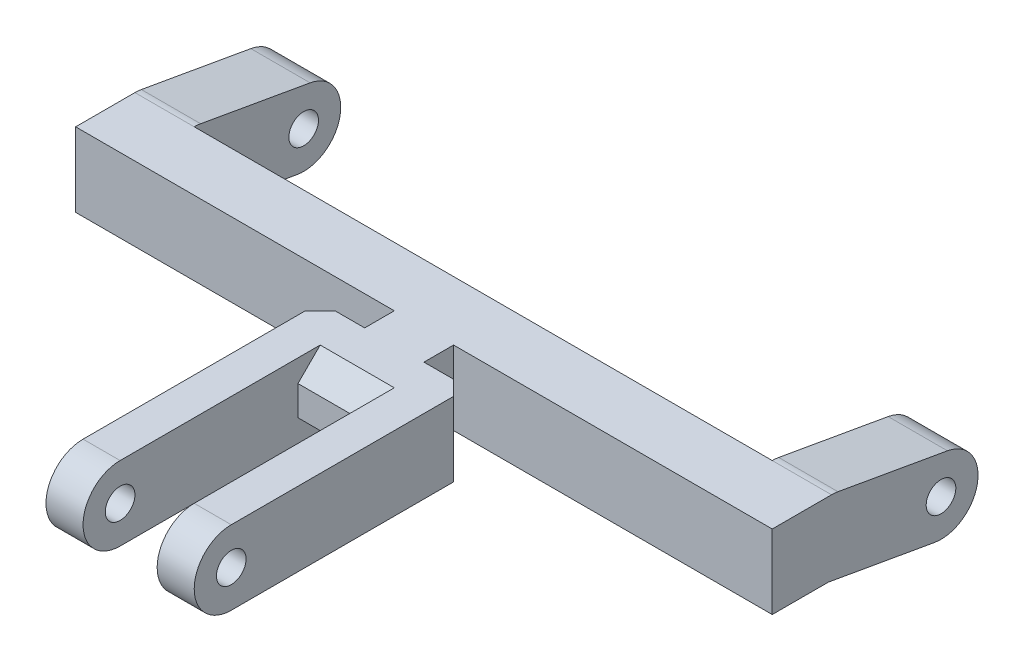
ISO-10303-21;
HEADER;
FILE_DESCRIPTION(('STEP AP214'),'2;1');
FILE_NAME('part.step','',(''),(''),'','','');
FILE_SCHEMA(('AUTOMOTIVE_DESIGN { 1 0 10303 214 1 1 1 1 }'));
ENDSEC;
DATA;
#1=APPLICATION_CONTEXT('core data for automotive mechanical design processes');
#2=APPLICATION_PROTOCOL_DEFINITION('international standard','automotive_design',2000,#1);
#3=PRODUCT_CONTEXT('',#1,'mechanical');
#4=PRODUCT('Part','Part','',(#3));
#5=PRODUCT_RELATED_PRODUCT_CATEGORY('part','',(#4));
#6=PRODUCT_DEFINITION_FORMATION('','',#4);
#7=PRODUCT_DEFINITION_CONTEXT('part definition',#1,'design');
#8=PRODUCT_DEFINITION('design','',#6,#7);
#9=PRODUCT_DEFINITION_SHAPE('','',#8);
#10=(LENGTH_UNIT() NAMED_UNIT(*) SI_UNIT(.MILLI.,.METRE.));
#11=(NAMED_UNIT(*) PLANE_ANGLE_UNIT() SI_UNIT($,.RADIAN.));
#12=(NAMED_UNIT(*) SI_UNIT($,.STERADIAN.) SOLID_ANGLE_UNIT());
#13=UNCERTAINTY_MEASURE_WITH_UNIT(LENGTH_MEASURE(1.E-05),#10,'distance_accuracy_value','');
#14=(GEOMETRIC_REPRESENTATION_CONTEXT(3) GLOBAL_UNCERTAINTY_ASSIGNED_CONTEXT((#13)) GLOBAL_UNIT_ASSIGNED_CONTEXT((#10,
#11,#12)) REPRESENTATION_CONTEXT('',''));
#15=CARTESIAN_POINT('',(0.,0.,0.));
#16=DIRECTION('',(0.,0.,1.));
#17=DIRECTION('',(1.,0.,0.));
#18=AXIS2_PLACEMENT_3D('',#15,#16,#17);
#19=CARTESIAN_POINT('',(10.,10.,20.));
#20=DIRECTION('',(0.,0.,-1.));
#21=DIRECTION('',(-1.,0.,0.));
#22=AXIS2_PLACEMENT_3D('',#19,#20,#21);
#23=PLANE('',#22);
#24=DIRECTION('',(0.,-1.,0.));
#25=VECTOR('',#24,1.);
#26=CARTESIAN_POINT('',(4.99999999999999,10.,20.));
#27=LINE('',#26,#25);
#28=CARTESIAN_POINT('',(4.99999999999999,7.00000000000001,20.));
#29=VERTEX_POINT('',#28);
#30=CARTESIAN_POINT('',(4.99999999999999,2.99999999999999,20.));
#31=VERTEX_POINT('',#30);
#32=EDGE_CURVE('E258',#29,#31,#27,.T.);
#33=ORIENTED_EDGE('',*,*,#32,.F.);
#34=DIRECTION('',(-1.,0.,0.));
#35=VECTOR('',#34,1.);
#36=CARTESIAN_POINT('',(-4.99999999999999,7.00000000000001,20.));
#37=LINE('',#36,#35);
#38=CARTESIAN_POINT('',(-4.99999999999999,7.00000000000001,20.));
#39=VERTEX_POINT('',#38);
#40=EDGE_CURVE('E462',#29,#39,#37,.T.);
#41=ORIENTED_EDGE('',*,*,#40,.T.);
#42=DIRECTION('',(0.,1.,0.));
#43=VECTOR('',#42,1.);
#44=CARTESIAN_POINT('',(-4.99999999999999,10.,20.));
#45=LINE('',#44,#43);
#46=CARTESIAN_POINT('',(-4.99999999999999,2.99999999999999,20.));
#47=VERTEX_POINT('',#46);
#48=EDGE_CURVE('E281',#47,#39,#45,.T.);
#49=ORIENTED_EDGE('',*,*,#48,.F.);
#50=DIRECTION('',(1.,0.,0.));
#51=VECTOR('',#50,1.);
#52=CARTESIAN_POINT('',(10.,2.99999999999999,20.));
#53=LINE('',#52,#51);
#54=EDGE_CURVE('E459',#47,#31,#53,.T.);
#55=ORIENTED_EDGE('',*,*,#54,.T.);
#56=EDGE_LOOP('',(#33,#41,#49,#55));
#57=FACE_BOUND('',#56,.T.);
#58=ADVANCED_FACE('F36',(#57),#23,.F.);
#59=CARTESIAN_POINT('',(-9.99999999999999,10.,12.));
#60=DIRECTION('',(0.,0.,1.));
#61=DIRECTION('',(1.,0.,0.));
#62=AXIS2_PLACEMENT_3D('',#59,#60,#61);
#63=PLANE('',#62);
#64=DIRECTION('',(-1.,0.,0.));
#65=VECTOR('',#64,1.);
#66=CARTESIAN_POINT('',(-9.99999999999999,0.,12.));
#67=LINE('',#66,#65);
#68=CARTESIAN_POINT('',(-3.99999999999999,0.,12.));
#69=VERTEX_POINT('',#68);
#70=CARTESIAN_POINT('',(-7.99999999999999,0.,12.));
#71=VERTEX_POINT('',#70);
#72=EDGE_CURVE('E358',#69,#71,#67,.T.);
#73=ORIENTED_EDGE('',*,*,#72,.T.);
#74=DIRECTION('',(0.,1.,0.));
#75=VECTOR('',#74,1.);
#76=CARTESIAN_POINT('',(-7.99999999999999,10.,12.));
#77=LINE('',#76,#75);
#78=CARTESIAN_POINT('',(-7.99999999999999,10.,12.));
#79=VERTEX_POINT('',#78);
#80=EDGE_CURVE('E447',#71,#79,#77,.T.);
#81=ORIENTED_EDGE('',*,*,#80,.T.);
#82=DIRECTION('',(-1.,0.,0.));
#83=VECTOR('',#82,1.);
#84=CARTESIAN_POINT('',(-9.99999999999999,10.,12.));
#85=LINE('',#84,#83);
#86=CARTESIAN_POINT('',(-3.99999999999999,10.,12.));
#87=VERTEX_POINT('',#86);
#88=EDGE_CURVE('E359',#87,#79,#85,.T.);
#89=ORIENTED_EDGE('',*,*,#88,.F.);
#90=DIRECTION('',(0.,-1.,0.));
#91=VECTOR('',#90,1.);
#92=CARTESIAN_POINT('',(-3.99999999999999,10.,12.));
#93=LINE('',#92,#91);
#94=EDGE_CURVE('E387',#87,#69,#93,.T.);
#95=ORIENTED_EDGE('',*,*,#94,.T.);
#96=EDGE_LOOP('',(#73,#81,#89,#95));
#97=FACE_BOUND('',#96,.T.);
#98=ADVANCED_FACE('F492',(#97),#63,.F.);
#99=CARTESIAN_POINT('',(-9.99999999999999,10.,20.));
#100=DIRECTION('',(1.,0.,0.));
#101=DIRECTION('',(0.,0.,-1.));
#102=AXIS2_PLACEMENT_3D('',#99,#100,#101);
#103=PLANE('',#102);
#104=DIRECTION('',(0.,0.,1.));
#105=VECTOR('',#104,1.);
#106=CARTESIAN_POINT('',(-9.99999999999999,0.,20.));
#107=LINE('',#106,#105);
#108=CARTESIAN_POINT('',(-9.99999999999999,0.,14.));
#109=VERTEX_POINT('',#108);
#110=CARTESIAN_POINT('',(-9.99999999999999,0.,44.));
#111=VERTEX_POINT('',#110);
#112=EDGE_CURVE('E390',#109,#111,#107,.T.);
#113=ORIENTED_EDGE('',*,*,#112,.T.);
#114=CARTESIAN_POINT('',(-9.99999999999999,5.,44.));
#115=DIRECTION('',(-1.,0.,0.));
#116=DIRECTION('',(0.,0.,1.));
#117=AXIS2_PLACEMENT_3D('',#114,#115,#116);
#118=CIRCLE('',#117,5.);
#119=CARTESIAN_POINT('',(-9.99999999999999,10.,44.));
#120=VERTEX_POINT('',#119);
#121=EDGE_CURVE('E266',#111,#120,#118,.T.);
#122=ORIENTED_EDGE('',*,*,#121,.T.);
#123=DIRECTION('',(0.,0.,1.));
#124=VECTOR('',#123,1.);
#125=CARTESIAN_POINT('',(-9.99999999999999,10.,20.));
#126=LINE('',#125,#124);
#127=CARTESIAN_POINT('',(-9.99999999999999,10.,14.));
#128=VERTEX_POINT('',#127);
#129=EDGE_CURVE('E362',#128,#120,#126,.T.);
#130=ORIENTED_EDGE('',*,*,#129,.F.);
#131=DIRECTION('',(0.,-1.,0.));
#132=VECTOR('',#131,1.);
#133=CARTESIAN_POINT('',(-9.99999999999999,10.,14.));
#134=LINE('',#133,#132);
#135=EDGE_CURVE('E440',#128,#109,#134,.T.);
#136=ORIENTED_EDGE('',*,*,#135,.T.);
#137=EDGE_LOOP('',(#113,#122,#130,#136));
#138=FACE_BOUND('',#137,.T.);
#139=CARTESIAN_POINT('',(-9.99999999999999,5.,44.));
#140=DIRECTION('',(-1.,0.,0.));
#141=DIRECTION('',(0.,0.,1.));
#142=AXIS2_PLACEMENT_3D('',#139,#140,#141);
#143=CIRCLE('',#142,2.);
#144=CARTESIAN_POINT('',(-9.99999999999999,5.,46.));
#145=VERTEX_POINT('',#144);
#146=EDGE_CURVE('E262',#145,#145,#143,.T.);
#147=ORIENTED_EDGE('',*,*,#146,.F.);
#148=EDGE_LOOP('',(#147));
#149=FACE_BOUND('',#148,.T.);
#150=ADVANCED_FACE('F482',(#138,#149),#103,.F.);
#151=CARTESIAN_POINT('',(10.,10.,20.));
#152=DIRECTION('',(-1.,0.,0.));
#153=DIRECTION('',(0.,0.,1.));
#154=AXIS2_PLACEMENT_3D('',#151,#152,#153);
#155=PLANE('',#154);
#156=DIRECTION('',(0.,0.,-1.));
#157=VECTOR('',#156,1.);
#158=CARTESIAN_POINT('',(10.,10.,20.));
#159=LINE('',#158,#157);
#160=CARTESIAN_POINT('',(9.99999999999999,10.,44.));
#161=VERTEX_POINT('',#160);
#162=CARTESIAN_POINT('',(10.,10.,14.));
#163=VERTEX_POINT('',#162);
#164=EDGE_CURVE('E365',#161,#163,#159,.T.);
#165=ORIENTED_EDGE('',*,*,#164,.F.);
#166=CARTESIAN_POINT('',(9.99999999999999,5.,44.));
#167=DIRECTION('',(-1.,0.,0.));
#168=DIRECTION('',(0.,0.,1.));
#169=AXIS2_PLACEMENT_3D('',#166,#167,#168);
#170=CIRCLE('',#169,5.);
#171=CARTESIAN_POINT('',(9.99999999999999,0.,44.));
#172=VERTEX_POINT('',#171);
#173=EDGE_CURVE('E241',#172,#161,#170,.T.);
#174=ORIENTED_EDGE('',*,*,#173,.F.);
#175=DIRECTION('',(0.,0.,-1.));
#176=VECTOR('',#175,1.);
#177=CARTESIAN_POINT('',(10.,0.,20.));
#178=LINE('',#177,#176);
#179=CARTESIAN_POINT('',(10.,0.,14.));
#180=VERTEX_POINT('',#179);
#181=EDGE_CURVE('E392',#172,#180,#178,.T.);
#182=ORIENTED_EDGE('',*,*,#181,.T.);
#183=DIRECTION('',(0.,1.,0.));
#184=VECTOR('',#183,1.);
#185=CARTESIAN_POINT('',(10.,10.,14.));
#186=LINE('',#185,#184);
#187=EDGE_CURVE('E456',#180,#163,#186,.T.);
#188=ORIENTED_EDGE('',*,*,#187,.T.);
#189=EDGE_LOOP('',(#165,#174,#182,#188));
#190=FACE_BOUND('',#189,.T.);
#191=CARTESIAN_POINT('',(9.99999999999999,5.,44.));
#192=DIRECTION('',(-1.,0.,0.));
#193=DIRECTION('',(0.,0.,1.));
#194=AXIS2_PLACEMENT_3D('',#191,#192,#193);
#195=CIRCLE('',#194,2.);
#196=CARTESIAN_POINT('',(9.99999999999999,5.,46.));
#197=VERTEX_POINT('',#196);
#198=EDGE_CURVE('E254',#197,#197,#195,.T.);
#199=ORIENTED_EDGE('',*,*,#198,.T.);
#200=EDGE_LOOP('',(#199));
#201=FACE_BOUND('',#200,.T.);
#202=ADVANCED_FACE('F576',(#190,#201),#155,.F.);
#203=CARTESIAN_POINT('',(4.00000000000001,10.,12.));
#204=DIRECTION('',(0.,0.,1.));
#205=DIRECTION('',(1.,0.,0.));
#206=AXIS2_PLACEMENT_3D('',#203,#204,#205);
#207=PLANE('',#206);
#208=DIRECTION('',(-1.,0.,0.));
#209=VECTOR('',#208,1.);
#210=CARTESIAN_POINT('',(4.00000000000001,10.,12.));
#211=LINE('',#210,#209);
#212=CARTESIAN_POINT('',(8.00000000000001,10.,12.));
#213=VERTEX_POINT('',#212);
#214=CARTESIAN_POINT('',(4.00000000000001,10.,12.));
#215=VERTEX_POINT('',#214);
#216=EDGE_CURVE('E367',#213,#215,#211,.T.);
#217=ORIENTED_EDGE('',*,*,#216,.F.);
#218=DIRECTION('',(0.,-1.,0.));
#219=VECTOR('',#218,1.);
#220=CARTESIAN_POINT('',(8.00000000000001,10.,12.));
#221=LINE('',#220,#219);
#222=CARTESIAN_POINT('',(8.00000000000001,0.,12.));
#223=VERTEX_POINT('',#222);
#224=EDGE_CURVE('E453',#213,#223,#221,.T.);
#225=ORIENTED_EDGE('',*,*,#224,.T.);
#226=DIRECTION('',(-1.,0.,0.));
#227=VECTOR('',#226,1.);
#228=CARTESIAN_POINT('',(4.00000000000001,0.,12.));
#229=LINE('',#228,#227);
#230=CARTESIAN_POINT('',(4.00000000000001,0.,12.));
#231=VERTEX_POINT('',#230);
#232=EDGE_CURVE('E395',#223,#231,#229,.T.);
#233=ORIENTED_EDGE('',*,*,#232,.T.);
#234=DIRECTION('',(0.,-1.,0.));
#235=VECTOR('',#234,1.);
#236=CARTESIAN_POINT('',(4.00000000000001,10.,12.));
#237=LINE('',#236,#235);
#238=EDGE_CURVE('E426',#215,#231,#237,.T.);
#239=ORIENTED_EDGE('',*,*,#238,.F.);
#240=EDGE_LOOP('',(#217,#225,#233,#239));
#241=FACE_BOUND('',#240,.T.);
#242=ADVANCED_FACE('F569',(#241),#207,.F.);
#243=CARTESIAN_POINT('',(4.00000000000001,10.,12.));
#244=DIRECTION('',(-1.,0.,0.));
#245=DIRECTION('',(0.,0.,1.));
#246=AXIS2_PLACEMENT_3D('',#243,#244,#245);
#247=PLANE('',#246);
#248=DIRECTION('',(0.,0.,-1.));
#249=VECTOR('',#248,1.);
#250=CARTESIAN_POINT('',(4.00000000000001,0.,12.));
#251=LINE('',#250,#249);
#252=CARTESIAN_POINT('',(4.00000000000001,0.,8.00000000000001));
#253=VERTEX_POINT('',#252);
#254=EDGE_CURVE('E397',#231,#253,#251,.T.);
#255=ORIENTED_EDGE('',*,*,#254,.T.);
#256=DIRECTION('',(0.,-1.,0.));
#257=VECTOR('',#256,1.);
#258=CARTESIAN_POINT('',(4.00000000000001,10.,8.00000000000001));
#259=LINE('',#258,#257);
#260=CARTESIAN_POINT('',(4.00000000000001,10.,8.00000000000001));
#261=VERTEX_POINT('',#260);
#262=EDGE_CURVE('E423',#261,#253,#259,.T.);
#263=ORIENTED_EDGE('',*,*,#262,.F.);
#264=DIRECTION('',(0.,0.,-1.));
#265=VECTOR('',#264,1.);
#266=CARTESIAN_POINT('',(4.00000000000001,10.,12.));
#267=LINE('',#266,#265);
#268=EDGE_CURVE('E369',#215,#261,#267,.T.);
#269=ORIENTED_EDGE('',*,*,#268,.F.);
#270=ORIENTED_EDGE('',*,*,#238,.T.);
#271=EDGE_LOOP('',(#255,#263,#269,#270));
#272=FACE_BOUND('',#271,.T.);
#273=ADVANCED_FACE('F564',(#272),#247,.F.);
#274=CARTESIAN_POINT('',(47.,10.,8.));
#275=DIRECTION('',(0.,0.,-1.));
#276=DIRECTION('',(-1.,0.,0.));
#277=AXIS2_PLACEMENT_3D('',#274,#275,#276);
#278=PLANE('',#277);
#279=DIRECTION('',(1.,0.,0.));
#280=VECTOR('',#279,1.);
#281=CARTESIAN_POINT('',(47.,0.,8.));
#282=LINE('',#281,#280);
#283=CARTESIAN_POINT('',(47.,0.,8.));
#284=VERTEX_POINT('',#283);
#285=EDGE_CURVE('E399',#253,#284,#282,.T.);
#286=ORIENTED_EDGE('',*,*,#285,.T.);
#287=DIRECTION('',(0.,-1.,0.));
#288=VECTOR('',#287,1.);
#289=CARTESIAN_POINT('',(47.,10.,8.));
#290=LINE('',#289,#288);
#291=CARTESIAN_POINT('',(47.,10.,8.));
#292=VERTEX_POINT('',#291);
#293=EDGE_CURVE('E420',#292,#284,#290,.T.);
#294=ORIENTED_EDGE('',*,*,#293,.F.);
#295=DIRECTION('',(1.,0.,0.));
#296=VECTOR('',#295,1.);
#297=CARTESIAN_POINT('',(47.,10.,8.));
#298=LINE('',#297,#296);
#299=EDGE_CURVE('E371',#261,#292,#298,.T.);
#300=ORIENTED_EDGE('',*,*,#299,.F.);
#301=ORIENTED_EDGE('',*,*,#262,.T.);
#302=EDGE_LOOP('',(#286,#294,#300,#301));
#303=FACE_BOUND('',#302,.T.);
#304=ADVANCED_FACE('F559',(#303),#278,.F.);
#305=CARTESIAN_POINT('',(47.,10.,8.));
#306=DIRECTION('',(-1.,0.,0.));
#307=DIRECTION('',(0.,0.,1.));
#308=AXIS2_PLACEMENT_3D('',#305,#306,#307);
#309=PLANE('',#308);
#310=DIRECTION('',(0.,0.,-1.));
#311=VECTOR('',#310,1.);
#312=CARTESIAN_POINT('',(47.,0.,8.));
#313=LINE('',#312,#311);
#314=CARTESIAN_POINT('',(47.,0.,0.43744331762962));
#315=VERTEX_POINT('',#314);
#316=EDGE_CURVE('E401',#284,#315,#313,.T.);
#317=ORIENTED_EDGE('',*,*,#316,.T.);
#318=DIRECTION('',(0.,-0.173648177666931,-0.984807753012208));
#319=VECTOR('',#318,1.);
#320=CARTESIAN_POINT('',(47.,1.59481025627687,9.48206172979246));
#321=LINE('',#320,#319);
#322=CARTESIAN_POINT('',(47.,-2.528761430065,-13.9038754068485));
#323=VERTEX_POINT('',#322);
#324=EDGE_CURVE('E344',#315,#323,#321,.T.);
#325=ORIENTED_EDGE('',*,*,#324,.T.);
#326=CARTESIAN_POINT('',(47.,2.39527733499604,-14.7721162951831));
#327=DIRECTION('',(-1.,0.,0.));
#328=DIRECTION('',(0.,0.,1.));
#329=AXIS2_PLACEMENT_3D('',#326,#327,#328);
#330=CIRCLE('',#329,5.);
#331=CARTESIAN_POINT('',(47.,7.31931610005708,-15.6403571835178));
#332=VERTEX_POINT('',#331);
#333=EDGE_CURVE('E332',#332,#323,#330,.T.);
#334=ORIENTED_EDGE('',*,*,#333,.F.);
#335=DIRECTION('',(0.,0.173648177666931,0.984807753012208));
#336=VECTOR('',#335,1.);
#337=CARTESIAN_POINT('',(47.,11.442887786399,7.74557995312315));
#338=LINE('',#337,#336);
#339=CARTESIAN_POINT('',(47.,9.92403876506104,-0.868240888334654));
#340=VERTEX_POINT('',#339);
#341=EDGE_CURVE('E325',#332,#340,#338,.T.);
#342=ORIENTED_EDGE('',*,*,#341,.T.);
#343=CARTESIAN_POINT('',(47.,5.,0.));
#344=DIRECTION('',(-1.,0.,0.));
#345=DIRECTION('',(0.,0.,1.));
#346=AXIS2_PLACEMENT_3D('',#343,#344,#345);
#347=CIRCLE('',#346,5.);
#348=CARTESIAN_POINT('',(47.,10.,0.));
#349=VERTEX_POINT('',#348);
#350=EDGE_CURVE('E342',#349,#340,#347,.T.);
#351=ORIENTED_EDGE('',*,*,#350,.F.);
#352=DIRECTION('',(0.,0.,-1.));
#353=VECTOR('',#352,1.);
#354=CARTESIAN_POINT('',(47.,10.,8.));
#355=LINE('',#354,#353);
#356=EDGE_CURVE('E373',#292,#349,#355,.T.);
#357=ORIENTED_EDGE('',*,*,#356,.F.);
#358=ORIENTED_EDGE('',*,*,#293,.T.);
#359=EDGE_LOOP('',(#317,#325,#334,#342,#351,#357,#358));
#360=FACE_BOUND('',#359,.T.);
#361=CARTESIAN_POINT('',(47.,2.39527733499604,-14.7721162951831));
#362=DIRECTION('',(-1.,0.,0.));
#363=DIRECTION('',(0.,0.,1.));
#364=AXIS2_PLACEMENT_3D('',#361,#362,#363);
#365=CIRCLE('',#364,2.00000000000001);
#366=CARTESIAN_POINT('',(47.,2.39527733499604,-12.7721162951831));
#367=VERTEX_POINT('',#366);
#368=EDGE_CURVE('E321',#367,#367,#365,.T.);
#369=ORIENTED_EDGE('',*,*,#368,.T.);
#370=EDGE_LOOP('',(#369));
#371=FACE_BOUND('',#370,.T.);
#372=ADVANCED_FACE('F553',(#360,#371),#309,.F.);
#373=CARTESIAN_POINT('',(-47.,10.,0.));
#374=DIRECTION('',(0.,0.,1.));
#375=DIRECTION('',(1.,0.,0.));
#376=AXIS2_PLACEMENT_3D('',#373,#374,#375);
#377=PLANE('',#376);
#378=DIRECTION('',(-1.,0.,0.));
#379=VECTOR('',#378,1.);
#380=CARTESIAN_POINT('',(-47.,0.,0.));
#381=LINE('',#380,#379);
#382=CARTESIAN_POINT('',(39.,0.,0.));
#383=VERTEX_POINT('',#382);
#384=CARTESIAN_POINT('',(-39.,0.,0.));
#385=VERTEX_POINT('',#384);
#386=EDGE_CURVE('E404',#383,#385,#381,.T.);
#387=ORIENTED_EDGE('',*,*,#386,.T.);
#388=DIRECTION('',(0.,1.,0.));
#389=VECTOR('',#388,1.);
#390=CARTESIAN_POINT('',(-39.,10.,0.));
#391=LINE('',#390,#389);
#392=CARTESIAN_POINT('',(-39.,10.,0.));
#393=VERTEX_POINT('',#392);
#394=EDGE_CURVE('E319',#385,#393,#391,.T.);
#395=ORIENTED_EDGE('',*,*,#394,.T.);
#396=DIRECTION('',(-1.,0.,0.));
#397=VECTOR('',#396,1.);
#398=CARTESIAN_POINT('',(-47.,10.,0.));
#399=LINE('',#398,#397);
#400=CARTESIAN_POINT('',(39.,10.,0.));
#401=VERTEX_POINT('',#400);
#402=EDGE_CURVE('E381',#401,#393,#399,.T.);
#403=ORIENTED_EDGE('',*,*,#402,.F.);
#404=DIRECTION('',(0.,-1.,0.));
#405=VECTOR('',#404,1.);
#406=CARTESIAN_POINT('',(39.,10.,0.));
#407=LINE('',#406,#405);
#408=EDGE_CURVE('E350',#401,#383,#407,.T.);
#409=ORIENTED_EDGE('',*,*,#408,.T.);
#410=EDGE_LOOP('',(#387,#395,#403,#409));
#411=FACE_BOUND('',#410,.T.);
#412=ADVANCED_FACE('F528',(#411),#377,.F.);
#413=CARTESIAN_POINT('',(-47.,10.,8.00000000000001));
#414=DIRECTION('',(1.,0.,0.));
#415=DIRECTION('',(0.,0.,-1.));
#416=AXIS2_PLACEMENT_3D('',#413,#414,#415);
#417=PLANE('',#416);
#418=DIRECTION('',(0.,0.,1.));
#419=VECTOR('',#418,1.);
#420=CARTESIAN_POINT('',(-47.,10.,8.00000000000001));
#421=LINE('',#420,#419);
#422=CARTESIAN_POINT('',(-47.,10.,0.));
#423=VERTEX_POINT('',#422);
#424=CARTESIAN_POINT('',(-47.,10.,8.00000000000001));
#425=VERTEX_POINT('',#424);
#426=EDGE_CURVE('E380',#423,#425,#421,.T.);
#427=ORIENTED_EDGE('',*,*,#426,.F.);
#428=CARTESIAN_POINT('',(-47.,5.,0.));
#429=DIRECTION('',(1.,0.,0.));
#430=DIRECTION('',(0.,0.,-1.));
#431=AXIS2_PLACEMENT_3D('',#428,#429,#430);
#432=CIRCLE('',#431,5.);
#433=CARTESIAN_POINT('',(-47.,9.92403876506104,-0.868240888334655));
#434=VERTEX_POINT('',#433);
#435=EDGE_CURVE('E290',#434,#423,#432,.T.);
#436=ORIENTED_EDGE('',*,*,#435,.F.);
#437=DIRECTION('',(0.,0.173648177666931,0.984807753012208));
#438=VECTOR('',#437,1.);
#439=CARTESIAN_POINT('',(-47.,11.442887786399,7.74557995312316));
#440=LINE('',#439,#438);
#441=CARTESIAN_POINT('',(-47.,7.31931610005708,-15.6403571835178));
#442=VERTEX_POINT('',#441);
#443=EDGE_CURVE('E297',#442,#434,#440,.T.);
#444=ORIENTED_EDGE('',*,*,#443,.F.);
#445=CARTESIAN_POINT('',(-47.,2.39527733499604,-14.7721162951831));
#446=DIRECTION('',(1.,0.,0.));
#447=DIRECTION('',(0.,0.,-1.));
#448=AXIS2_PLACEMENT_3D('',#445,#446,#447);
#449=CIRCLE('',#448,5.);
#450=CARTESIAN_POINT('',(-47.,-2.528761430065,-13.9038754068485));
#451=VERTEX_POINT('',#450);
#452=EDGE_CURVE('E308',#451,#442,#449,.T.);
#453=ORIENTED_EDGE('',*,*,#452,.F.);
#454=DIRECTION('',(0.,-0.173648177666931,-0.984807753012208));
#455=VECTOR('',#454,1.);
#456=CARTESIAN_POINT('',(-47.,1.59481025627687,9.48206172979247));
#457=LINE('',#456,#455);
#458=CARTESIAN_POINT('',(-47.,0.,0.437443317629623));
#459=VERTEX_POINT('',#458);
#460=EDGE_CURVE('E306',#459,#451,#457,.T.);
#461=ORIENTED_EDGE('',*,*,#460,.F.);
#462=DIRECTION('',(0.,0.,1.));
#463=VECTOR('',#462,1.);
#464=CARTESIAN_POINT('',(-47.,0.,8.00000000000001));
#465=LINE('',#464,#463);
#466=CARTESIAN_POINT('',(-47.,0.,8.00000000000001));
#467=VERTEX_POINT('',#466);
#468=EDGE_CURVE('E407',#459,#467,#465,.T.);
#469=ORIENTED_EDGE('',*,*,#468,.T.);
#470=DIRECTION('',(0.,-1.,0.));
#471=VECTOR('',#470,1.);
#472=CARTESIAN_POINT('',(-47.,10.,8.00000000000001));
#473=LINE('',#472,#471);
#474=EDGE_CURVE('E417',#425,#467,#473,.T.);
#475=ORIENTED_EDGE('',*,*,#474,.F.);
#476=EDGE_LOOP('',(#427,#436,#444,#453,#461,#469,#475));
#477=FACE_BOUND('',#476,.T.);
#478=CARTESIAN_POINT('',(-47.,2.39527733499604,-14.7721162951831));
#479=DIRECTION('',(1.,0.,0.));
#480=DIRECTION('',(0.,0.,-1.));
#481=AXIS2_PLACEMENT_3D('',#478,#479,#480);
#482=CIRCLE('',#481,2.00000000000001);
#483=CARTESIAN_POINT('',(-47.,2.39527733499604,-16.7721162951831));
#484=VERTEX_POINT('',#483);
#485=EDGE_CURVE('E286',#484,#484,#482,.T.);
#486=ORIENTED_EDGE('',*,*,#485,.T.);
#487=EDGE_LOOP('',(#486));
#488=FACE_BOUND('',#487,.T.);
#489=ADVANCED_FACE('F506',(#477,#488),#417,.F.);
#490=CARTESIAN_POINT('',(-3.99999999999999,10.,8.00000000000001));
#491=DIRECTION('',(0.,0.,-1.));
#492=DIRECTION('',(-1.,0.,0.));
#493=AXIS2_PLACEMENT_3D('',#490,#491,#492);
#494=PLANE('',#493);
#495=DIRECTION('',(1.,0.,0.));
#496=VECTOR('',#495,1.);
#497=CARTESIAN_POINT('',(-3.99999999999999,0.,8.00000000000001));
#498=LINE('',#497,#496);
#499=CARTESIAN_POINT('',(-3.99999999999999,0.,8.00000000000001));
#500=VERTEX_POINT('',#499);
#501=EDGE_CURVE('E409',#467,#500,#498,.T.);
#502=ORIENTED_EDGE('',*,*,#501,.T.);
#503=DIRECTION('',(0.,-1.,0.));
#504=VECTOR('',#503,1.);
#505=CARTESIAN_POINT('',(-3.99999999999999,10.,8.00000000000001));
#506=LINE('',#505,#504);
#507=CARTESIAN_POINT('',(-3.99999999999999,10.,8.00000000000001));
#508=VERTEX_POINT('',#507);
#509=EDGE_CURVE('E414',#508,#500,#506,.T.);
#510=ORIENTED_EDGE('',*,*,#509,.F.);
#511=DIRECTION('',(1.,0.,0.));
#512=VECTOR('',#511,1.);
#513=CARTESIAN_POINT('',(-3.99999999999999,10.,8.00000000000001));
#514=LINE('',#513,#512);
#515=EDGE_CURVE('E383',#425,#508,#514,.T.);
#516=ORIENTED_EDGE('',*,*,#515,.F.);
#517=ORIENTED_EDGE('',*,*,#474,.T.);
#518=EDGE_LOOP('',(#502,#510,#516,#517));
#519=FACE_BOUND('',#518,.T.);
#520=ADVANCED_FACE('F501',(#519),#494,.F.);
#521=CARTESIAN_POINT('',(-3.99999999999999,10.,12.));
#522=DIRECTION('',(1.,0.,0.));
#523=DIRECTION('',(0.,0.,-1.));
#524=AXIS2_PLACEMENT_3D('',#521,#522,#523);
#525=PLANE('',#524);
#526=DIRECTION('',(0.,0.,1.));
#527=VECTOR('',#526,1.);
#528=CARTESIAN_POINT('',(-3.99999999999999,0.,12.));
#529=LINE('',#528,#527);
#530=EDGE_CURVE('E363',#500,#69,#529,.T.);
#531=ORIENTED_EDGE('',*,*,#530,.T.);
#532=ORIENTED_EDGE('',*,*,#94,.F.);
#533=DIRECTION('',(0.,0.,1.));
#534=VECTOR('',#533,1.);
#535=CARTESIAN_POINT('',(-3.99999999999999,10.,12.));
#536=LINE('',#535,#534);
#537=EDGE_CURVE('E385',#508,#87,#536,.T.);
#538=ORIENTED_EDGE('',*,*,#537,.F.);
#539=ORIENTED_EDGE('',*,*,#509,.T.);
#540=EDGE_LOOP('',(#531,#532,#538,#539));
#541=FACE_BOUND('',#540,.T.);
#542=ADVANCED_FACE('F497',(#541),#525,.F.);
#543=CARTESIAN_POINT('',(0.,10.,0.));
#544=DIRECTION('',(0.,1.,0.));
#545=DIRECTION('',(0.,0.,1.));
#546=AXIS2_PLACEMENT_3D('',#543,#544,#545);
#547=PLANE('',#546);
#548=DIRECTION('',(1.,0.,0.));
#549=VECTOR('',#548,1.);
#550=CARTESIAN_POINT('',(4.99999999999999,10.,17.));
#551=LINE('',#550,#549);
#552=CARTESIAN_POINT('',(-4.99999999999999,10.,17.));
#553=VERTEX_POINT('',#552);
#554=CARTESIAN_POINT('',(4.99999999999999,10.,17.));
#555=VERTEX_POINT('',#554);
#556=EDGE_CURVE('E249',#553,#555,#551,.T.);
#557=ORIENTED_EDGE('',*,*,#556,.T.);
#558=DIRECTION('',(0.,0.,-1.));
#559=VECTOR('',#558,1.);
#560=CARTESIAN_POINT('',(4.99999999999999,10.,20.));
#561=LINE('',#560,#559);
#562=CARTESIAN_POINT('',(4.99999999999999,10.,44.));
#563=VERTEX_POINT('',#562);
#564=EDGE_CURVE('E231',#563,#555,#561,.T.);
#565=ORIENTED_EDGE('',*,*,#564,.F.);
#566=DIRECTION('',(1.,0.,0.));
#567=VECTOR('',#566,1.);
#568=CARTESIAN_POINT('',(4.99999999999999,10.,44.));
#569=LINE('',#568,#567);
#570=EDGE_CURVE('E238',#563,#161,#569,.T.);
#571=ORIENTED_EDGE('',*,*,#570,.T.);
#572=ORIENTED_EDGE('',*,*,#164,.T.);
#573=DIRECTION('',(0.70710678118655,0.,0.707106781186545));
#574=VECTOR('',#573,1.);
#575=CARTESIAN_POINT('',(-2.00000000000003,10.,2.00000000000004));
#576=LINE('',#575,#574);
#577=EDGE_CURVE('E449',#163,#213,#576,.F.);
#578=ORIENTED_EDGE('',*,*,#577,.T.);
#579=ORIENTED_EDGE('',*,*,#216,.T.);
#580=ORIENTED_EDGE('',*,*,#268,.T.);
#581=ORIENTED_EDGE('',*,*,#299,.T.);
#582=ORIENTED_EDGE('',*,*,#356,.T.);
#583=EDGE_CURVE('E377',#349,#401,#399,.T.);
#584=ORIENTED_EDGE('',*,*,#583,.T.);
#585=ORIENTED_EDGE('',*,*,#402,.T.);
#586=EDGE_CURVE('E376',#393,#423,#399,.T.);
#587=ORIENTED_EDGE('',*,*,#586,.T.);
#588=ORIENTED_EDGE('',*,*,#426,.T.);
#589=ORIENTED_EDGE('',*,*,#515,.T.);
#590=ORIENTED_EDGE('',*,*,#537,.T.);
#591=ORIENTED_EDGE('',*,*,#88,.T.);
#592=DIRECTION('',(0.707106781186548,0.,-0.707106781186548));
#593=VECTOR('',#592,1.);
#594=CARTESIAN_POINT('',(2.00000000000001,10.,2.00000000000001));
#595=LINE('',#594,#593);
#596=EDGE_CURVE('E451',#79,#128,#595,.F.);
#597=ORIENTED_EDGE('',*,*,#596,.T.);
#598=ORIENTED_EDGE('',*,*,#129,.T.);
#599=DIRECTION('',(-1.,0.,0.));
#600=VECTOR('',#599,1.);
#601=CARTESIAN_POINT('',(-4.99999999999999,10.,44.));
#602=LINE('',#601,#600);
#603=CARTESIAN_POINT('',(-4.99999999999999,10.,44.));
#604=VERTEX_POINT('',#603);
#605=EDGE_CURVE('E278',#604,#120,#602,.T.);
#606=ORIENTED_EDGE('',*,*,#605,.F.);
#607=DIRECTION('',(0.,0.,-1.));
#608=VECTOR('',#607,1.);
#609=CARTESIAN_POINT('',(-4.99999999999999,10.,20.));
#610=LINE('',#609,#608);
#611=EDGE_CURVE('E273',#604,#553,#610,.T.);
#612=ORIENTED_EDGE('',*,*,#611,.T.);
#613=EDGE_LOOP('',(#557,#565,#571,#572,#578,#579,#580,#581,#582,#584,#585,#587,#588,#589,#590,
#591,#597,#598,#606,#612));
#614=FACE_BOUND('',#613,.T.);
#615=ADVANCED_FACE('F247',(#614),#547,.T.);
#616=CARTESIAN_POINT('',(0.,0.,0.));
#617=DIRECTION('',(0.,1.,0.));
#618=DIRECTION('',(0.,0.,1.));
#619=AXIS2_PLACEMENT_3D('',#616,#617,#618);
#620=PLANE('',#619);
#621=DIRECTION('',(0.,0.,1.));
#622=VECTOR('',#621,1.);
#623=CARTESIAN_POINT('',(4.99999999999999,0.,20.));
#624=LINE('',#623,#622);
#625=CARTESIAN_POINT('',(4.99999999999999,0.,17.));
#626=VERTEX_POINT('',#625);
#627=CARTESIAN_POINT('',(4.99999999999999,0.,44.));
#628=VERTEX_POINT('',#627);
#629=EDGE_CURVE('E52',#626,#628,#624,.T.);
#630=ORIENTED_EDGE('',*,*,#629,.F.);
#631=DIRECTION('',(-1.,0.,0.));
#632=VECTOR('',#631,1.);
#633=CARTESIAN_POINT('',(0.,0.,17.));
#634=LINE('',#633,#632);
#635=CARTESIAN_POINT('',(-4.99999999999999,0.,17.));
#636=VERTEX_POINT('',#635);
#637=EDGE_CURVE('E464',#626,#636,#634,.T.);
#638=ORIENTED_EDGE('',*,*,#637,.T.);
#639=DIRECTION('',(0.,0.,1.));
#640=VECTOR('',#639,1.);
#641=CARTESIAN_POINT('',(-4.99999999999999,0.,20.));
#642=LINE('',#641,#640);
#643=CARTESIAN_POINT('',(-4.99999999999999,0.,44.));
#644=VERTEX_POINT('',#643);
#645=EDGE_CURVE('E59',#636,#644,#642,.T.);
#646=ORIENTED_EDGE('',*,*,#645,.T.);
#647=DIRECTION('',(-1.,0.,0.));
#648=VECTOR('',#647,1.);
#649=CARTESIAN_POINT('',(-4.99999999999999,0.,44.));
#650=LINE('',#649,#648);
#651=EDGE_CURVE('E275',#644,#111,#650,.T.);
#652=ORIENTED_EDGE('',*,*,#651,.T.);
#653=ORIENTED_EDGE('',*,*,#112,.F.);
#654=DIRECTION('',(-0.707106781186548,0.,0.707106781186548));
#655=VECTOR('',#654,1.);
#656=CARTESIAN_POINT('',(-9.99999999999999,0.,14.));
#657=LINE('',#656,#655);
#658=EDGE_CURVE('E445',#109,#71,#657,.F.);
#659=ORIENTED_EDGE('',*,*,#658,.T.);
#660=ORIENTED_EDGE('',*,*,#72,.F.);
#661=ORIENTED_EDGE('',*,*,#530,.F.);
#662=ORIENTED_EDGE('',*,*,#501,.F.);
#663=ORIENTED_EDGE('',*,*,#468,.F.);
#664=DIRECTION('',(-1.,0.,0.));
#665=VECTOR('',#664,1.);
#666=CARTESIAN_POINT('',(0.,0.,0.437443317629622));
#667=LINE('',#666,#665);
#668=CARTESIAN_POINT('',(-39.,0.,0.437443317629622));
#669=VERTEX_POINT('',#668);
#670=EDGE_CURVE('E435',#669,#459,#667,.T.);
#671=ORIENTED_EDGE('',*,*,#670,.F.);
#672=DIRECTION('',(0.,0.,-1.));
#673=VECTOR('',#672,1.);
#674=CARTESIAN_POINT('',(-39.,0.,0.));
#675=LINE('',#674,#673);
#676=EDGE_CURVE('E438',#669,#385,#675,.T.);
#677=ORIENTED_EDGE('',*,*,#676,.T.);
#678=ORIENTED_EDGE('',*,*,#386,.F.);
#679=DIRECTION('',(0.,0.,1.));
#680=VECTOR('',#679,1.);
#681=CARTESIAN_POINT('',(39.,0.,0.));
#682=LINE('',#681,#680);
#683=CARTESIAN_POINT('',(39.,0.,0.437443317629616));
#684=VERTEX_POINT('',#683);
#685=EDGE_CURVE('E432',#383,#684,#682,.T.);
#686=ORIENTED_EDGE('',*,*,#685,.T.);
#687=DIRECTION('',(1.,0.,0.));
#688=VECTOR('',#687,1.);
#689=CARTESIAN_POINT('',(0.,0.,0.43744331762962));
#690=LINE('',#689,#688);
#691=EDGE_CURVE('E429',#684,#315,#690,.T.);
#692=ORIENTED_EDGE('',*,*,#691,.T.);
#693=ORIENTED_EDGE('',*,*,#316,.F.);
#694=ORIENTED_EDGE('',*,*,#285,.F.);
#695=ORIENTED_EDGE('',*,*,#254,.F.);
#696=ORIENTED_EDGE('',*,*,#232,.F.);
#697=DIRECTION('',(-0.70710678118655,0.,-0.707106781186545));
#698=VECTOR('',#697,1.);
#699=CARTESIAN_POINT('',(8.00000000000001,0.,12.));
#700=LINE('',#699,#698);
#701=EDGE_CURVE('E443',#223,#180,#700,.F.);
#702=ORIENTED_EDGE('',*,*,#701,.T.);
#703=ORIENTED_EDGE('',*,*,#181,.F.);
#704=DIRECTION('',(1.,0.,0.));
#705=VECTOR('',#704,1.);
#706=CARTESIAN_POINT('',(4.99999999999999,0.,44.));
#707=LINE('',#706,#705);
#708=EDGE_CURVE('E244',#628,#172,#707,.T.);
#709=ORIENTED_EDGE('',*,*,#708,.F.);
#710=EDGE_LOOP('',(#630,#638,#646,#652,#653,#659,#660,#661,#662,#663,#671,#677,#678,#686,#692,
#693,#694,#695,#696,#702,#703,#709));
#711=FACE_BOUND('',#710,.T.);
#712=ADVANCED_FACE('F475',(#711),#620,.F.);
#713=CARTESIAN_POINT('',(39.,5.,0.));
#714=DIRECTION('',(-1.,0.,0.));
#715=DIRECTION('',(0.,0.,1.));
#716=AXIS2_PLACEMENT_3D('',#713,#714,#715);
#717=PLANE('',#716);
#718=CARTESIAN_POINT('',(39.,2.39527733499604,-14.7721162951831));
#719=DIRECTION('',(-1.,0.,0.));
#720=DIRECTION('',(0.,0.,1.));
#721=AXIS2_PLACEMENT_3D('',#718,#719,#720);
#722=CIRCLE('',#721,2.00000000000001);
#723=CARTESIAN_POINT('',(39.,2.39527733499604,-12.7721162951831));
#724=VERTEX_POINT('',#723);
#725=EDGE_CURVE('E322',#724,#724,#722,.T.);
#726=ORIENTED_EDGE('',*,*,#725,.F.);
#727=EDGE_LOOP('',(#726));
#728=FACE_BOUND('',#727,.T.);
#729=ORIENTED_EDGE('',*,*,#408,.F.);
#730=CARTESIAN_POINT('',(39.,5.,0.));
#731=DIRECTION('',(-1.,0.,0.));
#732=DIRECTION('',(0.,0.,1.));
#733=AXIS2_PLACEMENT_3D('',#730,#731,#732);
#734=CIRCLE('',#733,5.);
#735=CARTESIAN_POINT('',(39.,9.92403876506104,-0.868240888334654));
#736=VERTEX_POINT('',#735);
#737=EDGE_CURVE('E331',#401,#736,#734,.T.);
#738=ORIENTED_EDGE('',*,*,#737,.T.);
#739=DIRECTION('',(0.,0.173648177666931,0.984807753012208));
#740=VECTOR('',#739,1.);
#741=CARTESIAN_POINT('',(39.,11.442887786399,7.74557995312315));
#742=LINE('',#741,#740);
#743=CARTESIAN_POINT('',(39.,7.31931610005708,-15.6403571835178));
#744=VERTEX_POINT('',#743);
#745=EDGE_CURVE('E328',#744,#736,#742,.T.);
#746=ORIENTED_EDGE('',*,*,#745,.F.);
#747=CARTESIAN_POINT('',(39.,2.39527733499604,-14.7721162951831));
#748=DIRECTION('',(-1.,0.,0.));
#749=DIRECTION('',(0.,0.,1.));
#750=AXIS2_PLACEMENT_3D('',#747,#748,#749);
#751=CIRCLE('',#750,5.);
#752=CARTESIAN_POINT('',(39.,-2.528761430065,-13.9038754068485));
#753=VERTEX_POINT('',#752);
#754=EDGE_CURVE('E336',#744,#753,#751,.T.);
#755=ORIENTED_EDGE('',*,*,#754,.T.);
#756=DIRECTION('',(0.,-0.173648177666931,-0.984807753012208));
#757=VECTOR('',#756,1.);
#758=CARTESIAN_POINT('',(39.,1.59481025627687,9.48206172979246));
#759=LINE('',#758,#757);
#760=EDGE_CURVE('E334',#684,#753,#759,.T.);
#761=ORIENTED_EDGE('',*,*,#760,.F.);
#762=ORIENTED_EDGE('',*,*,#685,.F.);
#763=EDGE_LOOP('',(#729,#738,#746,#755,#761,#762));
#764=FACE_BOUND('',#763,.T.);
#765=ADVANCED_FACE('F533',(#728,#764),#717,.T.);
#766=CARTESIAN_POINT('',(39.,1.59481025627687,9.48206172979246));
#767=DIRECTION('',(0.,-0.984807753012208,0.173648177666931));
#768=DIRECTION('',(0.,-0.173648177666931,-0.984807753012208));
#769=AXIS2_PLACEMENT_3D('',#766,#767,#768);
#770=PLANE('',#769);
#771=ORIENTED_EDGE('',*,*,#691,.F.);
#772=ORIENTED_EDGE('',*,*,#760,.T.);
#773=DIRECTION('',(1.,0.,0.));
#774=VECTOR('',#773,1.);
#775=CARTESIAN_POINT('',(39.,-2.528761430065,-13.9038754068485));
#776=LINE('',#775,#774);
#777=EDGE_CURVE('E351',#753,#323,#776,.T.);
#778=ORIENTED_EDGE('',*,*,#777,.T.);
#779=ORIENTED_EDGE('',*,*,#324,.F.);
#780=EDGE_LOOP('',(#771,#772,#778,#779));
#781=FACE_BOUND('',#780,.T.);
#782=ADVANCED_FACE('F549',(#781),#770,.T.);
#783=CARTESIAN_POINT('',(39.,11.442887786399,7.74557995312315));
#784=DIRECTION('',(0.,0.984807753012208,-0.173648177666931));
#785=DIRECTION('',(0.,0.173648177666931,0.984807753012208));
#786=AXIS2_PLACEMENT_3D('',#783,#784,#785);
#787=PLANE('',#786);
#788=ORIENTED_EDGE('',*,*,#341,.F.);
#789=DIRECTION('',(1.,0.,0.));
#790=VECTOR('',#789,1.);
#791=CARTESIAN_POINT('',(39.,7.31931610005708,-15.6403571835178));
#792=LINE('',#791,#790);
#793=EDGE_CURVE('E348',#744,#332,#792,.T.);
#794=ORIENTED_EDGE('',*,*,#793,.F.);
#795=ORIENTED_EDGE('',*,*,#745,.T.);
#796=DIRECTION('',(1.,0.,0.));
#797=VECTOR('',#796,1.);
#798=CARTESIAN_POINT('',(39.,9.92403876506104,-0.868240888334654));
#799=LINE('',#798,#797);
#800=EDGE_CURVE('E339',#736,#340,#799,.T.);
#801=ORIENTED_EDGE('',*,*,#800,.T.);
#802=EDGE_LOOP('',(#788,#794,#795,#801));
#803=FACE_BOUND('',#802,.T.);
#804=ADVANCED_FACE('F542',(#803),#787,.T.);
#805=CARTESIAN_POINT('',(39.,2.39527733499604,-14.7721162951831));
#806=DIRECTION('',(1.,0.,0.));
#807=DIRECTION('',(0.,0.,-1.));
#808=AXIS2_PLACEMENT_3D('',#805,#806,#807);
#809=CYLINDRICAL_SURFACE('',#808,5.);
#810=ORIENTED_EDGE('',*,*,#333,.T.);
#811=ORIENTED_EDGE('',*,*,#777,.F.);
#812=ORIENTED_EDGE('',*,*,#754,.F.);
#813=ORIENTED_EDGE('',*,*,#793,.T.);
#814=EDGE_LOOP('',(#810,#811,#812,#813));
#815=FACE_BOUND('',#814,.T.);
#816=ADVANCED_FACE('F546',(#815),#809,.T.);
#817=CARTESIAN_POINT('',(39.,5.,0.));
#818=DIRECTION('',(1.,0.,0.));
#819=DIRECTION('',(0.,0.,-1.));
#820=AXIS2_PLACEMENT_3D('',#817,#818,#819);
#821=CYLINDRICAL_SURFACE('',#820,5.);
#822=ORIENTED_EDGE('',*,*,#583,.F.);
#823=ORIENTED_EDGE('',*,*,#350,.T.);
#824=ORIENTED_EDGE('',*,*,#800,.F.);
#825=ORIENTED_EDGE('',*,*,#737,.F.);
#826=EDGE_LOOP('',(#822,#823,#824,#825));
#827=FACE_BOUND('',#826,.T.);
#828=ADVANCED_FACE('F538',(#827),#821,.T.);
#829=CARTESIAN_POINT('',(39.,2.39527733499604,-14.7721162951831));
#830=DIRECTION('',(1.,0.,0.));
#831=DIRECTION('',(0.,0.,-1.));
#832=AXIS2_PLACEMENT_3D('',#829,#830,#831);
#833=CYLINDRICAL_SURFACE('',#832,2.00000000000001);
#834=ORIENTED_EDGE('',*,*,#725,.T.);
#835=EDGE_LOOP('',(#834));
#836=FACE_BOUND('',#835,.T.);
#837=ORIENTED_EDGE('',*,*,#368,.F.);
#838=EDGE_LOOP('',(#837));
#839=FACE_BOUND('',#838,.T.);
#840=ADVANCED_FACE('F651',(#836,#839),#833,.F.);
#841=CARTESIAN_POINT('',(-39.,5.,0.));
#842=DIRECTION('',(-1.,0.,0.));
#843=DIRECTION('',(0.,0.,1.));
#844=AXIS2_PLACEMENT_3D('',#841,#842,#843);
#845=CYLINDRICAL_SURFACE('',#844,5.);
#846=ORIENTED_EDGE('',*,*,#435,.T.);
#847=ORIENTED_EDGE('',*,*,#586,.F.);
#848=CARTESIAN_POINT('',(-39.,5.,0.));
#849=DIRECTION('',(1.,0.,0.));
#850=DIRECTION('',(0.,0.,-1.));
#851=AXIS2_PLACEMENT_3D('',#848,#849,#850);
#852=CIRCLE('',#851,5.);
#853=CARTESIAN_POINT('',(-39.,9.92403876506104,-0.868240888334655));
#854=VERTEX_POINT('',#853);
#855=EDGE_CURVE('E293',#854,#393,#852,.T.);
#856=ORIENTED_EDGE('',*,*,#855,.F.);
#857=DIRECTION('',(-1.,0.,0.));
#858=VECTOR('',#857,1.);
#859=CARTESIAN_POINT('',(-39.,9.92403876506104,-0.868240888334655));
#860=LINE('',#859,#858);
#861=EDGE_CURVE('E303',#854,#434,#860,.T.);
#862=ORIENTED_EDGE('',*,*,#861,.T.);
#863=EDGE_LOOP('',(#846,#847,#856,#862));
#864=FACE_BOUND('',#863,.T.);
#865=ADVANCED_FACE('F581',(#864),#845,.T.);
#866=CARTESIAN_POINT('',(-39.,5.,0.));
#867=DIRECTION('',(1.,0.,0.));
#868=DIRECTION('',(0.,0.,-1.));
#869=AXIS2_PLACEMENT_3D('',#866,#867,#868);
#870=PLANE('',#869);
#871=CARTESIAN_POINT('',(-39.,2.39527733499604,-14.7721162951831));
#872=DIRECTION('',(1.,0.,0.));
#873=DIRECTION('',(0.,0.,-1.));
#874=AXIS2_PLACEMENT_3D('',#871,#872,#873);
#875=CIRCLE('',#874,2.00000000000001);
#876=CARTESIAN_POINT('',(-39.,2.39527733499604,-16.7721162951831));
#877=VERTEX_POINT('',#876);
#878=EDGE_CURVE('E287',#877,#877,#875,.T.);
#879=ORIENTED_EDGE('',*,*,#878,.F.);
#880=EDGE_LOOP('',(#879));
#881=FACE_BOUND('',#880,.T.);
#882=ORIENTED_EDGE('',*,*,#394,.F.);
#883=ORIENTED_EDGE('',*,*,#676,.F.);
#884=DIRECTION('',(0.,-0.173648177666931,-0.984807753012208));
#885=VECTOR('',#884,1.);
#886=CARTESIAN_POINT('',(-39.,1.59481025627687,9.48206172979247));
#887=LINE('',#886,#885);
#888=CARTESIAN_POINT('',(-39.,-2.528761430065,-13.9038754068485));
#889=VERTEX_POINT('',#888);
#890=EDGE_CURVE('E296',#669,#889,#887,.T.);
#891=ORIENTED_EDGE('',*,*,#890,.T.);
#892=CARTESIAN_POINT('',(-39.,2.39527733499604,-14.7721162951831));
#893=DIRECTION('',(1.,0.,0.));
#894=DIRECTION('',(0.,0.,-1.));
#895=AXIS2_PLACEMENT_3D('',#892,#893,#894);
#896=CIRCLE('',#895,5.);
#897=CARTESIAN_POINT('',(-39.,7.31931610005708,-15.6403571835178));
#898=VERTEX_POINT('',#897);
#899=EDGE_CURVE('E299',#889,#898,#896,.T.);
#900=ORIENTED_EDGE('',*,*,#899,.T.);
#901=DIRECTION('',(0.,0.173648177666931,0.984807753012208));
#902=VECTOR('',#901,1.);
#903=CARTESIAN_POINT('',(-39.,11.442887786399,7.74557995312316));
#904=LINE('',#903,#902);
#905=EDGE_CURVE('E301',#898,#854,#904,.T.);
#906=ORIENTED_EDGE('',*,*,#905,.T.);
#907=ORIENTED_EDGE('',*,*,#855,.T.);
#908=EDGE_LOOP('',(#882,#883,#891,#900,#906,#907));
#909=FACE_BOUND('',#908,.T.);
#910=ADVANCED_FACE('F523',(#881,#909),#870,.T.);
#911=CARTESIAN_POINT('',(-39.,1.59481025627687,9.48206172979247));
#912=DIRECTION('',(0.,0.984807753012208,-0.173648177666931));
#913=DIRECTION('',(0.,0.173648177666931,0.984807753012208));
#914=AXIS2_PLACEMENT_3D('',#911,#912,#913);
#915=PLANE('',#914);
#916=ORIENTED_EDGE('',*,*,#890,.F.);
#917=ORIENTED_EDGE('',*,*,#670,.T.);
#918=ORIENTED_EDGE('',*,*,#460,.T.);
#919=DIRECTION('',(-1.,0.,0.));
#920=VECTOR('',#919,1.);
#921=CARTESIAN_POINT('',(-39.,-2.528761430065,-13.9038754068485));
#922=LINE('',#921,#920);
#923=EDGE_CURVE('E316',#889,#451,#922,.T.);
#924=ORIENTED_EDGE('',*,*,#923,.F.);
#925=EDGE_LOOP('',(#916,#917,#918,#924));
#926=FACE_BOUND('',#925,.T.);
#927=ADVANCED_FACE('F515',(#926),#915,.F.);
#928=CARTESIAN_POINT('',(-39.,2.39527733499604,-14.7721162951831));
#929=DIRECTION('',(-1.,0.,0.));
#930=DIRECTION('',(0.,0.,1.));
#931=AXIS2_PLACEMENT_3D('',#928,#929,#930);
#932=CYLINDRICAL_SURFACE('',#931,5.);
#933=ORIENTED_EDGE('',*,*,#452,.T.);
#934=DIRECTION('',(-1.,0.,0.));
#935=VECTOR('',#934,1.);
#936=CARTESIAN_POINT('',(-39.,7.31931610005708,-15.6403571835178));
#937=LINE('',#936,#935);
#938=EDGE_CURVE('E313',#898,#442,#937,.T.);
#939=ORIENTED_EDGE('',*,*,#938,.F.);
#940=ORIENTED_EDGE('',*,*,#899,.F.);
#941=ORIENTED_EDGE('',*,*,#923,.T.);
#942=EDGE_LOOP('',(#933,#939,#940,#941));
#943=FACE_BOUND('',#942,.T.);
#944=ADVANCED_FACE('F518',(#943),#932,.T.);
#945=CARTESIAN_POINT('',(-39.,11.442887786399,7.74557995312316));
#946=DIRECTION('',(0.,-0.984807753012208,0.173648177666931));
#947=DIRECTION('',(0.,-0.173648177666931,-0.984807753012208));
#948=AXIS2_PLACEMENT_3D('',#945,#946,#947);
#949=PLANE('',#948);
#950=ORIENTED_EDGE('',*,*,#443,.T.);
#951=ORIENTED_EDGE('',*,*,#861,.F.);
#952=ORIENTED_EDGE('',*,*,#905,.F.);
#953=ORIENTED_EDGE('',*,*,#938,.T.);
#954=EDGE_LOOP('',(#950,#951,#952,#953));
#955=FACE_BOUND('',#954,.T.);
#956=ADVANCED_FACE('F583',(#955),#949,.F.);
#957=CARTESIAN_POINT('',(-39.,2.39527733499604,-14.7721162951831));
#958=DIRECTION('',(-1.,0.,0.));
#959=DIRECTION('',(0.,0.,1.));
#960=AXIS2_PLACEMENT_3D('',#957,#958,#959);
#961=CYLINDRICAL_SURFACE('',#960,2.00000000000001);
#962=ORIENTED_EDGE('',*,*,#878,.T.);
#963=EDGE_LOOP('',(#962));
#964=FACE_BOUND('',#963,.T.);
#965=ORIENTED_EDGE('',*,*,#485,.F.);
#966=EDGE_LOOP('',(#965));
#967=FACE_BOUND('',#966,.T.);
#968=ADVANCED_FACE('F585',(#964,#967),#961,.F.);
#969=CARTESIAN_POINT('',(-9.99999999999999,10.,14.));
#970=DIRECTION('',(0.707106781186547,0.,0.707106781186547));
#971=DIRECTION('',(0.,-1.,0.));
#972=AXIS2_PLACEMENT_3D('',#969,#970,#971);
#973=PLANE('',#972);
#974=ORIENTED_EDGE('',*,*,#596,.F.);
#975=ORIENTED_EDGE('',*,*,#80,.F.);
#976=ORIENTED_EDGE('',*,*,#658,.F.);
#977=ORIENTED_EDGE('',*,*,#135,.F.);
#978=EDGE_LOOP('',(#974,#975,#976,#977));
#979=FACE_BOUND('',#978,.T.);
#980=ADVANCED_FACE('F487',(#979),#973,.F.);
#981=CARTESIAN_POINT('',(8.00000000000001,10.,12.));
#982=DIRECTION('',(-0.707106781186545,0.,0.70710678118655));
#983=DIRECTION('',(0.,-1.,0.));
#984=AXIS2_PLACEMENT_3D('',#981,#982,#983);
#985=PLANE('',#984);
#986=ORIENTED_EDGE('',*,*,#577,.F.);
#987=ORIENTED_EDGE('',*,*,#187,.F.);
#988=ORIENTED_EDGE('',*,*,#701,.F.);
#989=ORIENTED_EDGE('',*,*,#224,.F.);
#990=EDGE_LOOP('',(#986,#987,#988,#989));
#991=FACE_BOUND('',#990,.T.);
#992=ADVANCED_FACE('F573',(#991),#985,.F.);
#993=CARTESIAN_POINT('',(-4.99999999999999,5.,20.));
#994=DIRECTION('',(-1.,0.,0.));
#995=DIRECTION('',(0.,0.,1.));
#996=AXIS2_PLACEMENT_3D('',#993,#994,#995);
#997=PLANE('',#996);
#998=CARTESIAN_POINT('',(-4.99999999999999,5.,44.));
#999=DIRECTION('',(-1.,0.,0.));
#1000=DIRECTION('',(0.,0.,1.));
#1001=AXIS2_PLACEMENT_3D('',#998,#999,#1000);
#1002=CIRCLE('',#1001,2.);
#1003=CARTESIAN_POINT('',(-4.99999999999999,5.,46.));
#1004=VERTEX_POINT('',#1003);
#1005=EDGE_CURVE('E263',#1004,#1004,#1002,.T.);
#1006=ORIENTED_EDGE('',*,*,#1005,.T.);
#1007=EDGE_LOOP('',(#1006));
#1008=FACE_BOUND('',#1007,.T.);
#1009=ORIENTED_EDGE('',*,*,#645,.F.);
#1010=DIRECTION('',(0.,-0.707106781186547,-0.707106781186549));
#1011=VECTOR('',#1010,1.);
#1012=CARTESIAN_POINT('',(-4.99999999999999,3.99999999999999,21.));
#1013=LINE('',#1012,#1011);
#1014=EDGE_CURVE('E11',#636,#47,#1013,.F.);
#1015=ORIENTED_EDGE('',*,*,#1014,.T.);
#1016=ORIENTED_EDGE('',*,*,#48,.T.);
#1017=DIRECTION('',(0.,0.707106781186548,-0.707106781186547));
#1018=VECTOR('',#1017,1.);
#1019=CARTESIAN_POINT('',(-4.99999999999999,6.,21.));
#1020=LINE('',#1019,#1018);
#1021=EDGE_CURVE('E468',#39,#553,#1020,.T.);
#1022=ORIENTED_EDGE('',*,*,#1021,.T.);
#1023=ORIENTED_EDGE('',*,*,#611,.F.);
#1024=CARTESIAN_POINT('',(-4.99999999999999,5.,44.));
#1025=DIRECTION('',(-1.,0.,0.));
#1026=DIRECTION('',(0.,0.,1.));
#1027=AXIS2_PLACEMENT_3D('',#1024,#1025,#1026);
#1028=CIRCLE('',#1027,5.);
#1029=EDGE_CURVE('E270',#644,#604,#1028,.T.);
#1030=ORIENTED_EDGE('',*,*,#1029,.F.);
#1031=EDGE_LOOP('',(#1009,#1015,#1016,#1022,#1023,#1030));
#1032=FACE_BOUND('',#1031,.T.);
#1033=ADVANCED_FACE('F617',(#1008,#1032),#997,.F.);
#1034=CARTESIAN_POINT('',(-4.99999999999999,5.,44.));
#1035=DIRECTION('',(-1.,0.,0.));
#1036=DIRECTION('',(0.,0.,1.));
#1037=AXIS2_PLACEMENT_3D('',#1034,#1035,#1036);
#1038=CYLINDRICAL_SURFACE('',#1037,5.);
#1039=ORIENTED_EDGE('',*,*,#121,.F.);
#1040=ORIENTED_EDGE('',*,*,#651,.F.);
#1041=ORIENTED_EDGE('',*,*,#1029,.T.);
#1042=ORIENTED_EDGE('',*,*,#605,.T.);
#1043=EDGE_LOOP('',(#1039,#1040,#1041,#1042));
#1044=FACE_BOUND('',#1043,.T.);
#1045=ADVANCED_FACE('F479',(#1044),#1038,.T.);
#1046=CARTESIAN_POINT('',(-4.99999999999999,5.,44.));
#1047=DIRECTION('',(-1.,0.,0.));
#1048=DIRECTION('',(0.,0.,1.));
#1049=AXIS2_PLACEMENT_3D('',#1046,#1047,#1048);
#1050=CYLINDRICAL_SURFACE('',#1049,2.);
#1051=ORIENTED_EDGE('',*,*,#1005,.F.);
#1052=EDGE_LOOP('',(#1051));
#1053=FACE_BOUND('',#1052,.T.);
#1054=ORIENTED_EDGE('',*,*,#146,.T.);
#1055=EDGE_LOOP('',(#1054));
#1056=FACE_BOUND('',#1055,.T.);
#1057=ADVANCED_FACE('F640',(#1053,#1056),#1050,.F.);
#1058=CARTESIAN_POINT('',(4.99999999999999,5.,20.));
#1059=DIRECTION('',(1.,0.,0.));
#1060=DIRECTION('',(0.,0.,1.));
#1061=AXIS2_PLACEMENT_3D('',#1058,#1059,#1060);
#1062=PLANE('',#1061);
#1063=CARTESIAN_POINT('',(4.99999999999999,5.,44.));
#1064=DIRECTION('',(-1.,0.,0.));
#1065=DIRECTION('',(0.,0.,1.));
#1066=AXIS2_PLACEMENT_3D('',#1063,#1064,#1065);
#1067=CIRCLE('',#1066,2.);
#1068=CARTESIAN_POINT('',(4.99999999999999,5.,46.));
#1069=VERTEX_POINT('',#1068);
#1070=EDGE_CURVE('E251',#1069,#1069,#1067,.T.);
#1071=ORIENTED_EDGE('',*,*,#1070,.F.);
#1072=EDGE_LOOP('',(#1071));
#1073=FACE_BOUND('',#1072,.T.);
#1074=ORIENTED_EDGE('',*,*,#564,.T.);
#1075=DIRECTION('',(0.,-0.707106781186548,0.707106781186547));
#1076=VECTOR('',#1075,1.);
#1077=CARTESIAN_POINT('',(4.99999999999999,6.,21.));
#1078=LINE('',#1077,#1076);
#1079=EDGE_CURVE('E466',#555,#29,#1078,.T.);
#1080=ORIENTED_EDGE('',*,*,#1079,.T.);
#1081=ORIENTED_EDGE('',*,*,#32,.T.);
#1082=DIRECTION('',(0.,0.707106781186547,0.707106781186549));
#1083=VECTOR('',#1082,1.);
#1084=CARTESIAN_POINT('',(4.99999999999999,3.99999999999999,21.));
#1085=LINE('',#1084,#1083);
#1086=EDGE_CURVE('E45',#31,#626,#1085,.F.);
#1087=ORIENTED_EDGE('',*,*,#1086,.T.);
#1088=ORIENTED_EDGE('',*,*,#629,.T.);
#1089=CARTESIAN_POINT('',(4.99999999999999,5.,44.));
#1090=DIRECTION('',(-1.,0.,0.));
#1091=DIRECTION('',(0.,0.,1.));
#1092=AXIS2_PLACEMENT_3D('',#1089,#1090,#1091);
#1093=CIRCLE('',#1092,5.);
#1094=EDGE_CURVE('E227',#628,#563,#1093,.T.);
#1095=ORIENTED_EDGE('',*,*,#1094,.T.);
#1096=EDGE_LOOP('',(#1074,#1080,#1081,#1087,#1088,#1095));
#1097=FACE_BOUND('',#1096,.T.);
#1098=ADVANCED_FACE('F229',(#1073,#1097),#1062,.F.);
#1099=CARTESIAN_POINT('',(4.99999999999999,5.,44.));
#1100=DIRECTION('',(1.,0.,0.));
#1101=DIRECTION('',(0.,0.,-1.));
#1102=AXIS2_PLACEMENT_3D('',#1099,#1100,#1101);
#1103=CYLINDRICAL_SURFACE('',#1102,5.);
#1104=ORIENTED_EDGE('',*,*,#173,.T.);
#1105=ORIENTED_EDGE('',*,*,#570,.F.);
#1106=ORIENTED_EDGE('',*,*,#1094,.F.);
#1107=ORIENTED_EDGE('',*,*,#708,.T.);
#1108=EDGE_LOOP('',(#1104,#1105,#1106,#1107));
#1109=FACE_BOUND('',#1108,.T.);
#1110=ADVANCED_FACE('F239',(#1109),#1103,.T.);
#1111=CARTESIAN_POINT('',(4.99999999999999,5.,44.));
#1112=DIRECTION('',(1.,0.,0.));
#1113=DIRECTION('',(0.,0.,-1.));
#1114=AXIS2_PLACEMENT_3D('',#1111,#1112,#1113);
#1115=CYLINDRICAL_SURFACE('',#1114,2.);
#1116=ORIENTED_EDGE('',*,*,#1070,.T.);
#1117=EDGE_LOOP('',(#1116));
#1118=FACE_BOUND('',#1117,.T.);
#1119=ORIENTED_EDGE('',*,*,#198,.F.);
#1120=EDGE_LOOP('',(#1119));
#1121=FACE_BOUND('',#1120,.T.);
#1122=ADVANCED_FACE('F622',(#1118,#1121),#1115,.F.);
#1123=CARTESIAN_POINT('',(0.,10.,17.));
#1124=DIRECTION('',(0.,0.707106781186547,0.707106781186548));
#1125=DIRECTION('',(-1.,0.,0.));
#1126=AXIS2_PLACEMENT_3D('',#1123,#1124,#1125);
#1127=PLANE('',#1126);
#1128=ORIENTED_EDGE('',*,*,#1021,.F.);
#1129=ORIENTED_EDGE('',*,*,#40,.F.);
#1130=ORIENTED_EDGE('',*,*,#1079,.F.);
#1131=ORIENTED_EDGE('',*,*,#556,.F.);
#1132=EDGE_LOOP('',(#1128,#1129,#1130,#1131));
#1133=FACE_BOUND('',#1132,.T.);
#1134=ADVANCED_FACE('F618',(#1133),#1127,.T.);
#1135=CARTESIAN_POINT('',(10.,2.99999999999999,20.));
#1136=DIRECTION('',(0.,0.707106781186549,-0.707106781186547));
#1137=DIRECTION('',(1.,0.,0.));
#1138=AXIS2_PLACEMENT_3D('',#1135,#1136,#1137);
#1139=PLANE('',#1138);
#1140=ORIENTED_EDGE('',*,*,#1014,.F.);
#1141=ORIENTED_EDGE('',*,*,#637,.F.);
#1142=ORIENTED_EDGE('',*,*,#1086,.F.);
#1143=ORIENTED_EDGE('',*,*,#54,.F.);
#1144=EDGE_LOOP('',(#1140,#1141,#1142,#1143));
#1145=FACE_BOUND('',#1144,.T.);
#1146=ADVANCED_FACE('F39',(#1145),#1139,.F.);
#1147=CLOSED_SHELL('',(#58,#98,#150,#202,#242,#273,#304,#372,#412,#489,#520,#542,#615,#712,#765,
#782,#804,#816,#828,#840,#865,#910,#927,#944,#956,#968,#980,#992,#1033,#1045,#1057,#1098,#1110,
#1122,#1134,#1146));
#1148=MANIFOLD_SOLID_BREP('B2',#1147);
#1149=ADVANCED_BREP_SHAPE_REPRESENTATION('',(#18,#1148),#14);
#1150=SHAPE_DEFINITION_REPRESENTATION(#9,#1149);
ENDSEC;
END-ISO-10303-21;
